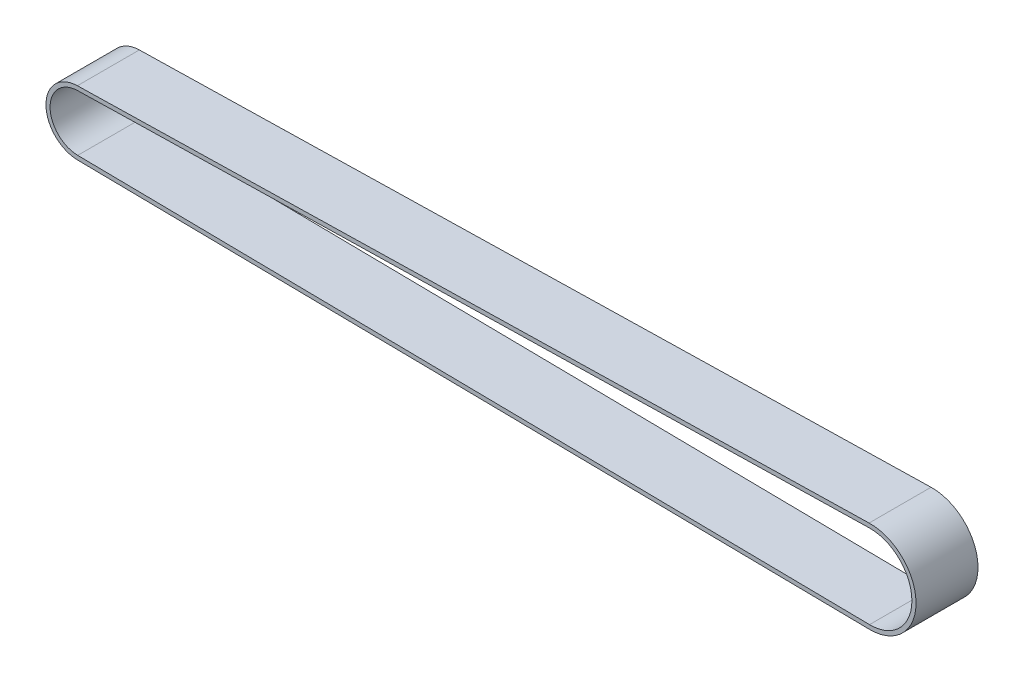
ISO-10303-21;
HEADER;
FILE_DESCRIPTION(('STEP AP214'),'2;1');
FILE_NAME('part.step','',(''),(''),'','','');
FILE_SCHEMA(('AUTOMOTIVE_DESIGN { 1 0 10303 214 1 1 1 1 }'));
ENDSEC;
DATA;
#1=APPLICATION_CONTEXT('core data for automotive mechanical design processes');
#2=APPLICATION_PROTOCOL_DEFINITION('international standard','automotive_design',2000,#1);
#3=PRODUCT_CONTEXT('',#1,'mechanical');
#4=PRODUCT('Part','Part','',(#3));
#5=PRODUCT_RELATED_PRODUCT_CATEGORY('part','',(#4));
#6=PRODUCT_DEFINITION_FORMATION('','',#4);
#7=PRODUCT_DEFINITION_CONTEXT('part definition',#1,'design');
#8=PRODUCT_DEFINITION('design','',#6,#7);
#9=PRODUCT_DEFINITION_SHAPE('','',#8);
#10=(LENGTH_UNIT() NAMED_UNIT(*) SI_UNIT(.MILLI.,.METRE.));
#11=(NAMED_UNIT(*) PLANE_ANGLE_UNIT() SI_UNIT($,.RADIAN.));
#12=(NAMED_UNIT(*) SI_UNIT($,.STERADIAN.) SOLID_ANGLE_UNIT());
#13=UNCERTAINTY_MEASURE_WITH_UNIT(LENGTH_MEASURE(1.E-05),#10,'distance_accuracy_value','');
#14=(GEOMETRIC_REPRESENTATION_CONTEXT(3) GLOBAL_UNCERTAINTY_ASSIGNED_CONTEXT((#13)) GLOBAL_UNIT_ASSIGNED_CONTEXT((#10,
#11,#12)) REPRESENTATION_CONTEXT('',''));
#15=CARTESIAN_POINT('',(0.,0.,0.));
#16=DIRECTION('',(0.,0.,1.));
#17=DIRECTION('',(1.,0.,0.));
#18=AXIS2_PLACEMENT_3D('',#15,#16,#17);
#19=CARTESIAN_POINT('',(3.91159327151058E-10,3.75255382323303E-11,7.5));
#20=DIRECTION('',(0.,0.,-1.));
#21=DIRECTION('',(-1.,0.,0.));
#22=AXIS2_PLACEMENT_3D('',#19,#20,#21);
#23=CYLINDRICAL_SURFACE('',#22,7.78);
#24=CARTESIAN_POINT('',(3.91159327151058E-10,3.75255382323303E-11,-7.5));
#25=DIRECTION('',(0.,0.,-1.));
#26=DIRECTION('',(-1.,0.,0.));
#27=AXIS2_PLACEMENT_3D('',#24,#25,#26);
#28=CIRCLE('',#27,7.78);
#29=CARTESIAN_POINT('',(-0.10326402733446,-7.77931465747427,-7.5));
#30=VERTEX_POINT('',#29);
#31=CARTESIAN_POINT('',(-0.168224600912089,7.77818105241194,-7.5));
#32=VERTEX_POINT('',#31);
#33=EDGE_CURVE('E176',#30,#32,#28,.T.);
#34=ORIENTED_EDGE('',*,*,#33,.F.);
#35=DIRECTION('',(0.,0.,-1.));
#36=VECTOR('',#35,1.);
#37=CARTESIAN_POINT('',(-0.10326402733446,-7.77931465747427,7.5));
#38=LINE('',#37,#36);
#39=CARTESIAN_POINT('',(-0.10326402733446,-7.77931465747427,7.5));
#40=VERTEX_POINT('',#39);
#41=EDGE_CURVE('E12',#40,#30,#38,.T.);
#42=ORIENTED_EDGE('',*,*,#41,.F.);
#43=CARTESIAN_POINT('',(3.91159327151058E-10,3.75255382323303E-11,7.5));
#44=DIRECTION('',(0.,0.,-1.));
#45=DIRECTION('',(-1.,0.,0.));
#46=AXIS2_PLACEMENT_3D('',#43,#44,#45);
#47=CIRCLE('',#46,7.78);
#48=CARTESIAN_POINT('',(-0.168224600912089,7.77818105241194,7.5));
#49=VERTEX_POINT('',#48);
#50=EDGE_CURVE('E182',#40,#49,#47,.T.);
#51=ORIENTED_EDGE('',*,*,#50,.T.);
#52=DIRECTION('',(0.,0.,-1.));
#53=VECTOR('',#52,1.);
#54=CARTESIAN_POINT('',(-0.168224600912089,7.77818105241194,7.5));
#55=LINE('',#54,#53);
#56=EDGE_CURVE('E70',#49,#32,#55,.T.);
#57=ORIENTED_EDGE('',*,*,#56,.T.);
#58=EDGE_LOOP('',(#34,#42,#51,#57));
#59=FACE_BOUND('',#58,.T.);
#60=ADVANCED_FACE('F67',(#59),#23,.T.);
#61=CARTESIAN_POINT('',(-0.103264027334429,-7.77931465747427,7.5));
#62=DIRECTION('',(-0.0132730112757825,-0.999911909705887,0.));
#63=DIRECTION('',(0.999911909705887,-0.0132730112757825,0.));
#64=AXIS2_PLACEMENT_3D('',#61,#62,#63);
#65=PLANE('',#64);
#66=DIRECTION('',(-0.999911909705887,0.0132730112757825,0.));
#67=VECTOR('',#66,1.);
#68=CARTESIAN_POINT('',(-0.103264027334429,-7.77931465747427,-7.5));
#69=LINE('',#68,#67);
#70=CARTESIAN_POINT('',(191.563102009364,-10.3235286156235,-7.5));
#71=VERTEX_POINT('',#70);
#72=EDGE_CURVE('E187',#71,#30,#69,.T.);
#73=ORIENTED_EDGE('',*,*,#72,.F.);
#74=DIRECTION('',(0.,0.,-1.));
#75=VECTOR('',#74,1.);
#76=CARTESIAN_POINT('',(191.563102009364,-10.3235286156235,7.5));
#77=LINE('',#76,#75);
#78=CARTESIAN_POINT('',(191.563102009364,-10.3235286156235,7.5));
#79=VERTEX_POINT('',#78);
#80=EDGE_CURVE('E76',#79,#71,#77,.T.);
#81=ORIENTED_EDGE('',*,*,#80,.F.);
#82=DIRECTION('',(-0.999911909705887,0.0132730112757825,0.));
#83=VECTOR('',#82,1.);
#84=CARTESIAN_POINT('',(-0.103264027334429,-7.77931465747427,7.5));
#85=LINE('',#84,#83);
#86=EDGE_CURVE('E195',#79,#40,#85,.T.);
#87=ORIENTED_EDGE('',*,*,#86,.T.);
#88=ORIENTED_EDGE('',*,*,#41,.T.);
#89=EDGE_LOOP('',(#73,#81,#87,#88));
#90=FACE_BOUND('',#89,.T.);
#91=ADVANCED_FACE('F229',(#90),#65,.T.);
#92=CARTESIAN_POINT('',(191.710764259807,0.800491379854495,7.5));
#93=DIRECTION('',(0.,0.,-1.));
#94=DIRECTION('',(-1.,0.,0.));
#95=AXIS2_PLACEMENT_3D('',#92,#93,#94);
#96=CYLINDRICAL_SURFACE('',#95,11.125);
#97=CARTESIAN_POINT('',(191.710764259807,0.800491379854495,-7.5));
#98=DIRECTION('',(0.,0.,-1.));
#99=DIRECTION('',(-1.,0.,0.));
#100=AXIS2_PLACEMENT_3D('',#97,#98,#99);
#101=CIRCLE('',#100,11.125);
#102=CARTESIAN_POINT('',(191.470211729023,11.9228903782691,-7.5));
#103=VERTEX_POINT('',#102);
#104=EDGE_CURVE('E206',#103,#71,#101,.T.);
#105=ORIENTED_EDGE('',*,*,#104,.F.);
#106=DIRECTION('',(0.,0.,-1.));
#107=VECTOR('',#106,1.);
#108=CARTESIAN_POINT('',(191.470211729023,11.9228903782691,7.5));
#109=LINE('',#108,#107);
#110=CARTESIAN_POINT('',(191.470211729023,11.9228903782691,7.5));
#111=VERTEX_POINT('',#110);
#112=EDGE_CURVE('E214',#111,#103,#109,.T.);
#113=ORIENTED_EDGE('',*,*,#112,.F.);
#114=CARTESIAN_POINT('',(191.710764259807,0.800491379854495,7.5));
#115=DIRECTION('',(0.,0.,-1.));
#116=DIRECTION('',(-1.,0.,0.));
#117=AXIS2_PLACEMENT_3D('',#114,#115,#116);
#118=CIRCLE('',#117,11.125);
#119=EDGE_CURVE('E191',#111,#79,#118,.T.);
#120=ORIENTED_EDGE('',*,*,#119,.T.);
#121=ORIENTED_EDGE('',*,*,#80,.T.);
#122=EDGE_LOOP('',(#105,#113,#120,#121));
#123=FACE_BOUND('',#122,.T.);
#124=ADVANCED_FACE('F233',(#123),#96,.T.);
#125=CARTESIAN_POINT('',(-0.16822460091209,7.77818105241194,7.5));
#126=DIRECTION('',(-0.0216226993963045,0.99976620210468,0.));
#127=DIRECTION('',(-0.999766202104681,-0.0216226993963045,0.));
#128=AXIS2_PLACEMENT_3D('',#125,#126,#127);
#129=PLANE('',#128);
#130=DIRECTION('',(0.999766202104681,0.0216226993963045,0.));
#131=VECTOR('',#130,1.);
#132=CARTESIAN_POINT('',(-0.16822460091209,7.77818105241194,-7.5));
#133=LINE('',#132,#131);
#134=EDGE_CURVE('E202',#32,#103,#133,.T.);
#135=ORIENTED_EDGE('',*,*,#134,.F.);
#136=ORIENTED_EDGE('',*,*,#56,.F.);
#137=DIRECTION('',(0.999766202104681,0.0216226993963045,0.));
#138=VECTOR('',#137,1.);
#139=CARTESIAN_POINT('',(-0.16822460091209,7.77818105241194,7.5));
#140=LINE('',#139,#138);
#141=EDGE_CURVE('E186',#49,#111,#140,.T.);
#142=ORIENTED_EDGE('',*,*,#141,.T.);
#143=ORIENTED_EDGE('',*,*,#112,.T.);
#144=EDGE_LOOP('',(#135,#136,#142,#143));
#145=FACE_BOUND('',#144,.T.);
#146=ADVANCED_FACE('F224',(#145),#129,.T.);
#147=CARTESIAN_POINT('',(3.91159327151058E-10,3.75255382323303E-11,7.5));
#148=DIRECTION('',(0.,0.,-1.));
#149=DIRECTION('',(-1.,0.,0.));
#150=AXIS2_PLACEMENT_3D('',#147,#148,#149);
#151=PLANE('',#150);
#152=DIRECTION('',(-0.999911909705887,0.0132730112757825,0.));
#153=VECTOR('',#152,1.);
#154=CARTESIAN_POINT('',(191.57637502064,-9.3236167059176,7.5));
#155=LINE('',#154,#153);
#156=CARTESIAN_POINT('',(191.57637502064,-9.3236167059176,7.5));
#157=VERTEX_POINT('',#156);
#158=CARTESIAN_POINT('',(-0.0899910160586462,-6.77940274776839,7.5));
#159=VERTEX_POINT('',#158);
#160=EDGE_CURVE('E142',#157,#159,#155,.T.);
#161=ORIENTED_EDGE('',*,*,#160,.T.);
#162=CARTESIAN_POINT('',(3.91159327151058E-10,3.75255382323303E-11,7.5));
#163=DIRECTION('',(0.,0.,-1.));
#164=DIRECTION('',(-1.,0.,0.));
#165=AXIS2_PLACEMENT_3D('',#162,#163,#164);
#166=CIRCLE('',#165,6.78);
#167=CARTESIAN_POINT('',(-0.146601901515785,6.77841485030726,7.5));
#168=VERTEX_POINT('',#167);
#169=EDGE_CURVE('E135',#159,#168,#166,.T.);
#170=ORIENTED_EDGE('',*,*,#169,.T.);
#171=DIRECTION('',(0.999766202104681,0.0216226993963045,0.));
#172=VECTOR('',#171,1.);
#173=CARTESIAN_POINT('',(-0.146601901515785,6.77841485030726,7.5));
#174=LINE('',#173,#172);
#175=CARTESIAN_POINT('',(191.491834428419,10.9231241761644,7.5));
#176=VERTEX_POINT('',#175);
#177=EDGE_CURVE('E145',#168,#176,#174,.T.);
#178=ORIENTED_EDGE('',*,*,#177,.T.);
#179=CARTESIAN_POINT('',(191.710764259807,0.800491379854495,7.5));
#180=DIRECTION('',(0.,0.,-1.));
#181=DIRECTION('',(-1.,0.,0.));
#182=AXIS2_PLACEMENT_3D('',#179,#180,#181);
#183=CIRCLE('',#182,10.125);
#184=EDGE_CURVE('E84',#176,#157,#183,.T.);
#185=ORIENTED_EDGE('',*,*,#184,.T.);
#186=EDGE_LOOP('',(#161,#170,#178,#185));
#187=FACE_BOUND('',#186,.T.);
#188=ORIENTED_EDGE('',*,*,#50,.F.);
#189=ORIENTED_EDGE('',*,*,#86,.F.);
#190=ORIENTED_EDGE('',*,*,#119,.F.);
#191=ORIENTED_EDGE('',*,*,#141,.F.);
#192=EDGE_LOOP('',(#188,#189,#190,#191));
#193=FACE_BOUND('',#192,.T.);
#194=ADVANCED_FACE('F150',(#187,#193),#151,.F.);
#195=CARTESIAN_POINT('',(3.91159327151058E-10,3.75255382323303E-11,-7.5));
#196=DIRECTION('',(0.,0.,-1.));
#197=DIRECTION('',(-1.,0.,0.));
#198=AXIS2_PLACEMENT_3D('',#195,#196,#197);
#199=PLANE('',#198);
#200=CARTESIAN_POINT('',(3.91159327151058E-10,3.75255382323303E-11,-7.5));
#201=DIRECTION('',(0.,0.,-1.));
#202=DIRECTION('',(-1.,0.,0.));
#203=AXIS2_PLACEMENT_3D('',#200,#201,#202);
#204=CIRCLE('',#203,6.78);
#205=CARTESIAN_POINT('',(-0.0899910160586462,-6.77940274776839,-7.5));
#206=VERTEX_POINT('',#205);
#207=CARTESIAN_POINT('',(-0.146601901515785,6.77841485030726,-7.5));
#208=VERTEX_POINT('',#207);
#209=EDGE_CURVE('E92',#206,#208,#204,.T.);
#210=ORIENTED_EDGE('',*,*,#209,.F.);
#211=DIRECTION('',(-0.999911909705887,0.0132730112757825,0.));
#212=VECTOR('',#211,1.);
#213=CARTESIAN_POINT('',(191.57637502064,-9.3236167059176,-7.5));
#214=LINE('',#213,#212);
#215=CARTESIAN_POINT('',(191.57637502064,-9.3236167059176,-7.5));
#216=VERTEX_POINT('',#215);
#217=EDGE_CURVE('E154',#216,#206,#214,.T.);
#218=ORIENTED_EDGE('',*,*,#217,.F.);
#219=CARTESIAN_POINT('',(191.710764259807,0.800491379854495,-7.5));
#220=DIRECTION('',(0.,0.,-1.));
#221=DIRECTION('',(-1.,0.,0.));
#222=AXIS2_PLACEMENT_3D('',#219,#220,#221);
#223=CIRCLE('',#222,10.125);
#224=CARTESIAN_POINT('',(191.491834428419,10.9231241761644,-7.5));
#225=VERTEX_POINT('',#224);
#226=EDGE_CURVE('E158',#225,#216,#223,.T.);
#227=ORIENTED_EDGE('',*,*,#226,.F.);
#228=DIRECTION('',(0.999766202104681,0.0216226993963045,0.));
#229=VECTOR('',#228,1.);
#230=CARTESIAN_POINT('',(-0.146601901515785,6.77841485030726,-7.5));
#231=LINE('',#230,#229);
#232=EDGE_CURVE('E167',#208,#225,#231,.T.);
#233=ORIENTED_EDGE('',*,*,#232,.F.);
#234=EDGE_LOOP('',(#210,#218,#227,#233));
#235=FACE_BOUND('',#234,.T.);
#236=ORIENTED_EDGE('',*,*,#33,.T.);
#237=ORIENTED_EDGE('',*,*,#134,.T.);
#238=ORIENTED_EDGE('',*,*,#104,.T.);
#239=ORIENTED_EDGE('',*,*,#72,.T.);
#240=EDGE_LOOP('',(#236,#237,#238,#239));
#241=FACE_BOUND('',#240,.T.);
#242=ADVANCED_FACE('F226',(#235,#241),#199,.T.);
#243=CARTESIAN_POINT('',(3.91159327151058E-10,3.75255382323303E-11,7.5));
#244=DIRECTION('',(0.,0.,-1.));
#245=DIRECTION('',(-1.,0.,0.));
#246=AXIS2_PLACEMENT_3D('',#243,#244,#245);
#247=CYLINDRICAL_SURFACE('',#246,6.78);
#248=ORIENTED_EDGE('',*,*,#209,.T.);
#249=DIRECTION('',(0.,0.,-1.));
#250=VECTOR('',#249,1.);
#251=CARTESIAN_POINT('',(-0.146601901515785,6.77841485030726,7.5));
#252=LINE('',#251,#250);
#253=EDGE_CURVE('E131',#168,#208,#252,.T.);
#254=ORIENTED_EDGE('',*,*,#253,.F.);
#255=ORIENTED_EDGE('',*,*,#169,.F.);
#256=DIRECTION('',(0.,0.,-1.));
#257=VECTOR('',#256,1.);
#258=CARTESIAN_POINT('',(-0.0899910160586462,-6.77940274776839,7.5));
#259=LINE('',#258,#257);
#260=EDGE_CURVE('E173',#159,#206,#259,.T.);
#261=ORIENTED_EDGE('',*,*,#260,.T.);
#262=EDGE_LOOP('',(#248,#254,#255,#261));
#263=FACE_BOUND('',#262,.T.);
#264=ADVANCED_FACE('F133',(#263),#247,.F.);
#265=CARTESIAN_POINT('',(191.57637502064,-9.3236167059176,7.5));
#266=DIRECTION('',(-0.0132730112757825,-0.999911909705887,0.));
#267=DIRECTION('',(0.999911909705887,-0.0132730112757825,0.));
#268=AXIS2_PLACEMENT_3D('',#265,#266,#267);
#269=PLANE('',#268);
#270=ORIENTED_EDGE('',*,*,#217,.T.);
#271=ORIENTED_EDGE('',*,*,#260,.F.);
#272=ORIENTED_EDGE('',*,*,#160,.F.);
#273=DIRECTION('',(0.,0.,-1.));
#274=VECTOR('',#273,1.);
#275=CARTESIAN_POINT('',(191.57637502064,-9.3236167059176,7.5));
#276=LINE('',#275,#274);
#277=EDGE_CURVE('E177',#157,#216,#276,.T.);
#278=ORIENTED_EDGE('',*,*,#277,.T.);
#279=EDGE_LOOP('',(#270,#271,#272,#278));
#280=FACE_BOUND('',#279,.T.);
#281=ADVANCED_FACE('F289',(#280),#269,.F.);
#282=CARTESIAN_POINT('',(191.710764259807,0.800491379854495,7.5));
#283=DIRECTION('',(0.,0.,-1.));
#284=DIRECTION('',(-1.,0.,0.));
#285=AXIS2_PLACEMENT_3D('',#282,#283,#284);
#286=CYLINDRICAL_SURFACE('',#285,10.125);
#287=ORIENTED_EDGE('',*,*,#226,.T.);
#288=ORIENTED_EDGE('',*,*,#277,.F.);
#289=ORIENTED_EDGE('',*,*,#184,.F.);
#290=DIRECTION('',(0.,0.,-1.));
#291=VECTOR('',#290,1.);
#292=CARTESIAN_POINT('',(191.491834428419,10.9231241761644,7.5));
#293=LINE('',#292,#291);
#294=EDGE_CURVE('E141',#176,#225,#293,.T.);
#295=ORIENTED_EDGE('',*,*,#294,.T.);
#296=EDGE_LOOP('',(#287,#288,#289,#295));
#297=FACE_BOUND('',#296,.T.);
#298=ADVANCED_FACE('F299',(#297),#286,.F.);
#299=CARTESIAN_POINT('',(-0.146601901515785,6.77841485030726,7.5));
#300=DIRECTION('',(-0.0216226993963045,0.99976620210468,0.));
#301=DIRECTION('',(-0.999766202104681,-0.0216226993963045,0.));
#302=AXIS2_PLACEMENT_3D('',#299,#300,#301);
#303=PLANE('',#302);
#304=ORIENTED_EDGE('',*,*,#232,.T.);
#305=ORIENTED_EDGE('',*,*,#294,.F.);
#306=ORIENTED_EDGE('',*,*,#177,.F.);
#307=ORIENTED_EDGE('',*,*,#253,.T.);
#308=EDGE_LOOP('',(#304,#305,#306,#307));
#309=FACE_BOUND('',#308,.T.);
#310=ADVANCED_FACE('F146',(#309),#303,.F.);
#311=CLOSED_SHELL('',(#60,#91,#124,#146,#194,#242,#264,#281,#298,#310));
#312=MANIFOLD_SOLID_BREP('B2',#311);
#313=ADVANCED_BREP_SHAPE_REPRESENTATION('',(#18,#312),#14);
#314=SHAPE_DEFINITION_REPRESENTATION(#9,#313);
ENDSEC;
END-ISO-10303-21;
